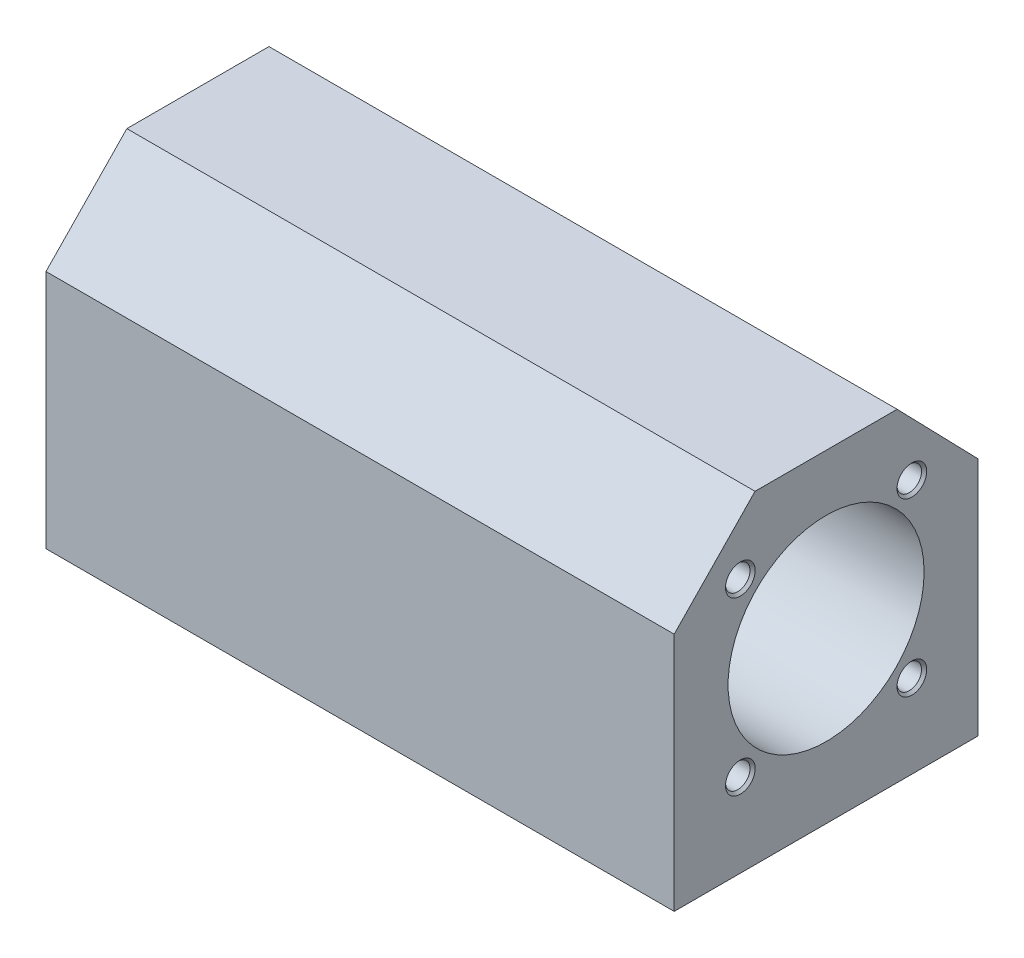
ISO-10303-21;
HEADER;
FILE_DESCRIPTION(('STEP AP214'),'2;1');
FILE_NAME('part.step','',(''),(''),'','','');
FILE_SCHEMA(('AUTOMOTIVE_DESIGN { 1 0 10303 214 1 1 1 1 }'));
ENDSEC;
DATA;
#1=APPLICATION_CONTEXT('core data for automotive mechanical design processes');
#2=APPLICATION_PROTOCOL_DEFINITION('international standard','automotive_design',2000,#1);
#3=PRODUCT_CONTEXT('',#1,'mechanical');
#4=PRODUCT('Part','Part','',(#3));
#5=PRODUCT_RELATED_PRODUCT_CATEGORY('part','',(#4));
#6=PRODUCT_DEFINITION_FORMATION('','',#4);
#7=PRODUCT_DEFINITION_CONTEXT('part definition',#1,'design');
#8=PRODUCT_DEFINITION('design','',#6,#7);
#9=PRODUCT_DEFINITION_SHAPE('','',#8);
#10=(LENGTH_UNIT() NAMED_UNIT(*) SI_UNIT(.MILLI.,.METRE.));
#11=(NAMED_UNIT(*) PLANE_ANGLE_UNIT() SI_UNIT($,.RADIAN.));
#12=(NAMED_UNIT(*) SI_UNIT($,.STERADIAN.) SOLID_ANGLE_UNIT());
#13=UNCERTAINTY_MEASURE_WITH_UNIT(LENGTH_MEASURE(1.E-05),#10,'distance_accuracy_value','');
#14=(GEOMETRIC_REPRESENTATION_CONTEXT(3) GLOBAL_UNCERTAINTY_ASSIGNED_CONTEXT((#13)) GLOBAL_UNIT_ASSIGNED_CONTEXT((#10,
#11,#12)) REPRESENTATION_CONTEXT('',''));
#15=CARTESIAN_POINT('',(0.,0.,0.));
#16=DIRECTION('',(0.,0.,1.));
#17=DIRECTION('',(1.,0.,0.));
#18=AXIS2_PLACEMENT_3D('',#15,#16,#17);
#19=CARTESIAN_POINT('',(-128.2,34.5,-31.));
#20=DIRECTION('',(1.,0.,0.));
#21=DIRECTION('',(0.,0.,-1.));
#22=AXIS2_PLACEMENT_3D('',#19,#20,#21);
#23=CYLINDRICAL_SURFACE('',#22,12.5);
#24=CARTESIAN_POINT('',(-78.2,34.5,-31.));
#25=DIRECTION('',(-1.,0.,0.));
#26=DIRECTION('',(0.,0.,1.));
#27=AXIS2_PLACEMENT_3D('',#24,#25,#26);
#28=CIRCLE('',#27,12.5);
#29=CARTESIAN_POINT('',(-78.2,34.5,-18.5));
#30=VERTEX_POINT('',#29);
#31=EDGE_CURVE('E149',#30,#30,#28,.F.);
#32=ORIENTED_EDGE('',*,*,#31,.F.);
#33=EDGE_LOOP('',(#32));
#34=FACE_BOUND('',#33,.T.);
#35=CARTESIAN_POINT('',(-70.,34.5,-31.));
#36=DIRECTION('',(1.,0.,0.));
#37=DIRECTION('',(0.,0.,-1.));
#38=AXIS2_PLACEMENT_3D('',#35,#36,#37);
#39=CIRCLE('',#38,12.5);
#40=CARTESIAN_POINT('',(-70.,34.5,-43.5));
#41=VERTEX_POINT('',#40);
#42=EDGE_CURVE('E42',#41,#41,#39,.F.);
#43=ORIENTED_EDGE('',*,*,#42,.F.);
#44=EDGE_LOOP('',(#43));
#45=FACE_BOUND('',#44,.T.);
#46=ADVANCED_FACE('F38',(#34,#45),#23,.F.);
#47=CARTESIAN_POINT('',(-128.2,0.,0.));
#48=DIRECTION('',(0.,0.,1.));
#49=DIRECTION('',(1.,0.,0.));
#50=AXIS2_PLACEMENT_3D('',#47,#48,#49);
#51=PLANE('',#50);
#52=DIRECTION('',(0.,-1.,0.));
#53=VECTOR('',#52,1.);
#54=CARTESIAN_POINT('',(0.,0.,0.));
#55=LINE('',#54,#53);
#56=CARTESIAN_POINT('',(0.,49.,0.));
#57=VERTEX_POINT('',#56);
#58=CARTESIAN_POINT('',(0.,0.,0.));
#59=VERTEX_POINT('',#58);
#60=EDGE_CURVE('E128',#57,#59,#55,.T.);
#61=ORIENTED_EDGE('',*,*,#60,.F.);
#62=DIRECTION('',(1.,0.,0.));
#63=VECTOR('',#62,1.);
#64=CARTESIAN_POINT('',(-128.2,49.,0.));
#65=LINE('',#64,#63);
#66=CARTESIAN_POINT('',(-128.2,49.,0.));
#67=VERTEX_POINT('',#66);
#68=EDGE_CURVE('E11',#67,#57,#65,.T.);
#69=ORIENTED_EDGE('',*,*,#68,.F.);
#70=DIRECTION('',(0.,-1.,0.));
#71=VECTOR('',#70,1.);
#72=CARTESIAN_POINT('',(-128.2,0.,0.));
#73=LINE('',#72,#71);
#74=CARTESIAN_POINT('',(-128.2,0.,0.));
#75=VERTEX_POINT('',#74);
#76=EDGE_CURVE('E143',#67,#75,#73,.T.);
#77=ORIENTED_EDGE('',*,*,#76,.T.);
#78=DIRECTION('',(1.,0.,0.));
#79=VECTOR('',#78,1.);
#80=CARTESIAN_POINT('',(-128.2,0.,0.));
#81=LINE('',#80,#79);
#82=EDGE_CURVE('E90',#75,#59,#81,.T.);
#83=ORIENTED_EDGE('',*,*,#82,.T.);
#84=EDGE_LOOP('',(#61,#69,#77,#83));
#85=FACE_BOUND('',#84,.T.);
#86=ADVANCED_FACE('F40',(#85),#51,.T.);
#87=CARTESIAN_POINT('',(-128.2,49.,0.));
#88=DIRECTION('',(0.,0.69647537716866,0.717580691628316));
#89=DIRECTION('',(0.,-0.717580691628316,0.69647537716866));
#90=AXIS2_PLACEMENT_3D('',#87,#88,#89);
#91=PLANE('',#90);
#92=DIRECTION('',(0.,-0.717580691628316,0.69647537716866));
#93=VECTOR('',#92,1.);
#94=CARTESIAN_POINT('',(0.,49.,0.));
#95=LINE('',#94,#93);
#96=CARTESIAN_POINT('',(0.,66.,-16.5));
#97=VERTEX_POINT('',#96);
#98=EDGE_CURVE('E141',#97,#57,#95,.T.);
#99=ORIENTED_EDGE('',*,*,#98,.F.);
#100=DIRECTION('',(1.,0.,0.));
#101=VECTOR('',#100,1.);
#102=CARTESIAN_POINT('',(-128.2,66.,-16.5));
#103=LINE('',#102,#101);
#104=CARTESIAN_POINT('',(-128.2,66.,-16.5));
#105=VERTEX_POINT('',#104);
#106=EDGE_CURVE('E48',#105,#97,#103,.T.);
#107=ORIENTED_EDGE('',*,*,#106,.F.);
#108=DIRECTION('',(0.,-0.717580691628316,0.69647537716866));
#109=VECTOR('',#108,1.);
#110=CARTESIAN_POINT('',(-128.2,49.,0.));
#111=LINE('',#110,#109);
#112=EDGE_CURVE('E118',#105,#67,#111,.T.);
#113=ORIENTED_EDGE('',*,*,#112,.T.);
#114=ORIENTED_EDGE('',*,*,#68,.T.);
#115=EDGE_LOOP('',(#99,#107,#113,#114));
#116=FACE_BOUND('',#115,.T.);
#117=ADVANCED_FACE('F204',(#116),#91,.T.);
#118=CARTESIAN_POINT('',(-128.2,66.,-16.5));
#119=DIRECTION('',(0.,1.,0.));
#120=DIRECTION('',(0.,0.,1.));
#121=AXIS2_PLACEMENT_3D('',#118,#119,#120);
#122=PLANE('',#121);
#123=DIRECTION('',(0.,0.,1.));
#124=VECTOR('',#123,1.);
#125=CARTESIAN_POINT('',(0.,66.,-16.5));
#126=LINE('',#125,#124);
#127=CARTESIAN_POINT('',(0.,66.,-45.5));
#128=VERTEX_POINT('',#127);
#129=EDGE_CURVE('E105',#128,#97,#126,.T.);
#130=ORIENTED_EDGE('',*,*,#129,.F.);
#131=DIRECTION('',(1.,0.,0.));
#132=VECTOR('',#131,1.);
#133=CARTESIAN_POINT('',(-128.2,66.,-45.5));
#134=LINE('',#133,#132);
#135=CARTESIAN_POINT('',(-128.2,66.,-45.5));
#136=VERTEX_POINT('',#135);
#137=EDGE_CURVE('E100',#136,#128,#134,.T.);
#138=ORIENTED_EDGE('',*,*,#137,.F.);
#139=DIRECTION('',(0.,0.,1.));
#140=VECTOR('',#139,1.);
#141=CARTESIAN_POINT('',(-128.2,66.,-16.5));
#142=LINE('',#141,#140);
#143=EDGE_CURVE('E103',#136,#105,#142,.T.);
#144=ORIENTED_EDGE('',*,*,#143,.T.);
#145=ORIENTED_EDGE('',*,*,#106,.T.);
#146=EDGE_LOOP('',(#130,#138,#144,#145));
#147=FACE_BOUND('',#146,.T.);
#148=ADVANCED_FACE('F102',(#147),#122,.T.);
#149=CARTESIAN_POINT('',(-128.2,66.,-45.5));
#150=DIRECTION('',(0.,0.69647537716866,-0.717580691628316));
#151=DIRECTION('',(0.,0.717580691628316,0.69647537716866));
#152=AXIS2_PLACEMENT_3D('',#149,#150,#151);
#153=PLANE('',#152);
#154=DIRECTION('',(0.,0.717580691628316,0.69647537716866));
#155=VECTOR('',#154,1.);
#156=CARTESIAN_POINT('',(0.,66.,-45.5));
#157=LINE('',#156,#155);
#158=CARTESIAN_POINT('',(0.,49.,-62.));
#159=VERTEX_POINT('',#158);
#160=EDGE_CURVE('E138',#159,#128,#157,.T.);
#161=ORIENTED_EDGE('',*,*,#160,.F.);
#162=DIRECTION('',(1.,0.,0.));
#163=VECTOR('',#162,1.);
#164=CARTESIAN_POINT('',(-128.2,49.,-62.));
#165=LINE('',#164,#163);
#166=CARTESIAN_POINT('',(-128.2,49.,-62.));
#167=VERTEX_POINT('',#166);
#168=EDGE_CURVE('E110',#167,#159,#165,.T.);
#169=ORIENTED_EDGE('',*,*,#168,.F.);
#170=DIRECTION('',(0.,0.717580691628316,0.69647537716866));
#171=VECTOR('',#170,1.);
#172=CARTESIAN_POINT('',(-128.2,66.,-45.5));
#173=LINE('',#172,#171);
#174=EDGE_CURVE('E116',#167,#136,#173,.T.);
#175=ORIENTED_EDGE('',*,*,#174,.T.);
#176=ORIENTED_EDGE('',*,*,#137,.T.);
#177=EDGE_LOOP('',(#161,#169,#175,#176));
#178=FACE_BOUND('',#177,.T.);
#179=ADVANCED_FACE('F120',(#178),#153,.T.);
#180=CARTESIAN_POINT('',(-128.2,0.,-62.));
#181=DIRECTION('',(0.,0.,-1.));
#182=DIRECTION('',(-1.,0.,0.));
#183=AXIS2_PLACEMENT_3D('',#180,#181,#182);
#184=PLANE('',#183);
#185=DIRECTION('',(0.,1.,0.));
#186=VECTOR('',#185,1.);
#187=CARTESIAN_POINT('',(0.,0.,-62.));
#188=LINE('',#187,#186);
#189=CARTESIAN_POINT('',(0.,0.,-62.));
#190=VERTEX_POINT('',#189);
#191=EDGE_CURVE('E135',#190,#159,#188,.T.);
#192=ORIENTED_EDGE('',*,*,#191,.F.);
#193=DIRECTION('',(1.,0.,0.));
#194=VECTOR('',#193,1.);
#195=CARTESIAN_POINT('',(-128.2,0.,-62.));
#196=LINE('',#195,#194);
#197=CARTESIAN_POINT('',(-128.2,0.,-62.));
#198=VERTEX_POINT('',#197);
#199=EDGE_CURVE('E147',#198,#190,#196,.T.);
#200=ORIENTED_EDGE('',*,*,#199,.F.);
#201=DIRECTION('',(0.,1.,0.));
#202=VECTOR('',#201,1.);
#203=CARTESIAN_POINT('',(-128.2,0.,-62.));
#204=LINE('',#203,#202);
#205=EDGE_CURVE('E121',#198,#167,#204,.T.);
#206=ORIENTED_EDGE('',*,*,#205,.T.);
#207=ORIENTED_EDGE('',*,*,#168,.T.);
#208=EDGE_LOOP('',(#192,#200,#206,#207));
#209=FACE_BOUND('',#208,.T.);
#210=ADVANCED_FACE('F414',(#209),#184,.T.);
#211=CARTESIAN_POINT('',(-128.2,0.,0.));
#212=DIRECTION('',(0.,-1.,0.));
#213=DIRECTION('',(0.,0.,-1.));
#214=AXIS2_PLACEMENT_3D('',#211,#212,#213);
#215=PLANE('',#214);
#216=DIRECTION('',(0.,0.,-1.));
#217=VECTOR('',#216,1.);
#218=CARTESIAN_POINT('',(0.,0.,0.));
#219=LINE('',#218,#217);
#220=EDGE_CURVE('E131',#59,#190,#219,.T.);
#221=ORIENTED_EDGE('',*,*,#220,.F.);
#222=ORIENTED_EDGE('',*,*,#82,.F.);
#223=DIRECTION('',(0.,0.,-1.));
#224=VECTOR('',#223,1.);
#225=CARTESIAN_POINT('',(-128.2,0.,0.));
#226=LINE('',#225,#224);
#227=EDGE_CURVE('E123',#75,#198,#226,.T.);
#228=ORIENTED_EDGE('',*,*,#227,.T.);
#229=ORIENTED_EDGE('',*,*,#199,.T.);
#230=EDGE_LOOP('',(#221,#222,#228,#229));
#231=FACE_BOUND('',#230,.T.);
#232=ADVANCED_FACE('F200',(#231),#215,.T.);
#233=CARTESIAN_POINT('',(-128.2,0.,0.));
#234=DIRECTION('',(-1.,0.,0.));
#235=DIRECTION('',(0.,0.,1.));
#236=AXIS2_PLACEMENT_3D('',#233,#234,#235);
#237=PLANE('',#236);
#238=CARTESIAN_POINT('',(-128.2,34.5,-31.));
#239=DIRECTION('',(-1.,0.,0.));
#240=DIRECTION('',(0.,0.,1.));
#241=AXIS2_PLACEMENT_3D('',#238,#239,#240);
#242=CIRCLE('',#241,29.);
#243=CARTESIAN_POINT('',(-128.2,34.5,-2.));
#244=VERTEX_POINT('',#243);
#245=EDGE_CURVE('E159',#244,#244,#242,.T.);
#246=ORIENTED_EDGE('',*,*,#245,.F.);
#247=EDGE_LOOP('',(#246));
#248=FACE_BOUND('',#247,.T.);
#249=ORIENTED_EDGE('',*,*,#76,.F.);
#250=ORIENTED_EDGE('',*,*,#112,.F.);
#251=ORIENTED_EDGE('',*,*,#143,.F.);
#252=ORIENTED_EDGE('',*,*,#174,.F.);
#253=ORIENTED_EDGE('',*,*,#205,.F.);
#254=ORIENTED_EDGE('',*,*,#227,.F.);
#255=EDGE_LOOP('',(#249,#250,#251,#252,#253,#254));
#256=FACE_BOUND('',#255,.T.);
#257=ADVANCED_FACE('F114',(#248,#256),#237,.T.);
#258=CARTESIAN_POINT('',(0.,0.,0.));
#259=DIRECTION('',(-1.,0.,0.));
#260=DIRECTION('',(0.,0.,1.));
#261=AXIS2_PLACEMENT_3D('',#258,#259,#260);
#262=PLANE('',#261);
#263=CARTESIAN_POINT('',(0.,34.5,-31.));
#264=DIRECTION('',(1.,0.,0.));
#265=DIRECTION('',(0.,0.,-1.));
#266=AXIS2_PLACEMENT_3D('',#263,#264,#265);
#267=CIRCLE('',#266,20.);
#268=CARTESIAN_POINT('',(0.,34.5,-51.));
#269=VERTEX_POINT('',#268);
#270=EDGE_CURVE('E166',#269,#269,#267,.T.);
#271=ORIENTED_EDGE('',*,*,#270,.F.);
#272=EDGE_LOOP('',(#271));
#273=FACE_BOUND('',#272,.T.);
#274=CARTESIAN_POINT('',(0.,52.,-13.5));
#275=DIRECTION('',(1.,0.,0.));
#276=DIRECTION('',(0.,0.,-1.));
#277=AXIS2_PLACEMENT_3D('',#274,#275,#276);
#278=CIRCLE('',#277,3.025);
#279=CARTESIAN_POINT('',(0.,52.,-16.525));
#280=VERTEX_POINT('',#279);
#281=EDGE_CURVE('E151',#280,#280,#278,.T.);
#282=ORIENTED_EDGE('',*,*,#281,.F.);
#283=EDGE_LOOP('',(#282));
#284=FACE_BOUND('',#283,.T.);
#285=CARTESIAN_POINT('',(0.,52.,-48.5));
#286=DIRECTION('',(1.,0.,0.));
#287=DIRECTION('',(0.,0.,-1.));
#288=AXIS2_PLACEMENT_3D('',#285,#286,#287);
#289=CIRCLE('',#288,3.025);
#290=CARTESIAN_POINT('',(0.,52.,-51.525));
#291=VERTEX_POINT('',#290);
#292=EDGE_CURVE('E174',#291,#291,#289,.T.);
#293=ORIENTED_EDGE('',*,*,#292,.F.);
#294=EDGE_LOOP('',(#293));
#295=FACE_BOUND('',#294,.T.);
#296=CARTESIAN_POINT('',(0.,17.,-48.5));
#297=DIRECTION('',(1.,0.,0.));
#298=DIRECTION('',(0.,0.,-1.));
#299=AXIS2_PLACEMENT_3D('',#296,#297,#298);
#300=CIRCLE('',#299,3.025);
#301=CARTESIAN_POINT('',(0.,17.,-51.525));
#302=VERTEX_POINT('',#301);
#303=EDGE_CURVE('E183',#302,#302,#300,.T.);
#304=ORIENTED_EDGE('',*,*,#303,.F.);
#305=EDGE_LOOP('',(#304));
#306=FACE_BOUND('',#305,.T.);
#307=CARTESIAN_POINT('',(0.,17.,-13.5));
#308=DIRECTION('',(1.,0.,0.));
#309=DIRECTION('',(0.,0.,-1.));
#310=AXIS2_PLACEMENT_3D('',#307,#308,#309);
#311=CIRCLE('',#310,3.025);
#312=CARTESIAN_POINT('',(0.,17.,-16.525));
#313=VERTEX_POINT('',#312);
#314=EDGE_CURVE('E192',#313,#313,#311,.T.);
#315=ORIENTED_EDGE('',*,*,#314,.F.);
#316=EDGE_LOOP('',(#315));
#317=FACE_BOUND('',#316,.T.);
#318=ORIENTED_EDGE('',*,*,#60,.T.);
#319=ORIENTED_EDGE('',*,*,#220,.T.);
#320=ORIENTED_EDGE('',*,*,#191,.T.);
#321=ORIENTED_EDGE('',*,*,#160,.T.);
#322=ORIENTED_EDGE('',*,*,#129,.T.);
#323=ORIENTED_EDGE('',*,*,#98,.T.);
#324=EDGE_LOOP('',(#318,#319,#320,#321,#322,#323));
#325=FACE_BOUND('',#324,.T.);
#326=ADVANCED_FACE('F203',(#273,#284,#295,#306,#317,#325),#262,.F.);
#327=CARTESIAN_POINT('',(-20.45,17.,-13.5));
#328=DIRECTION('',(1.,0.,0.));
#329=DIRECTION('',(0.,0.,-1.));
#330=AXIS2_PLACEMENT_3D('',#327,#328,#329);
#331=CONICAL_SURFACE('',#330,2.49999999999999,1.02974425867665);
#332=CARTESIAN_POINT('',(-21.9521515475689,17.,-13.5));
#333=VERTEX_POINT('',#332);
#334=VERTEX_LOOP('',#333);
#335=FACE_BOUND('',#334,.T.);
#336=CARTESIAN_POINT('',(-20.45,17.,-13.5));
#337=DIRECTION('',(1.,0.,0.));
#338=DIRECTION('',(0.,0.,-1.));
#339=AXIS2_PLACEMENT_3D('',#336,#337,#338);
#340=CIRCLE('',#339,2.49999999999999);
#341=CARTESIAN_POINT('',(-20.45,17.,-16.));
#342=VERTEX_POINT('',#341);
#343=EDGE_CURVE('E132',#342,#342,#340,.T.);
#344=ORIENTED_EDGE('',*,*,#343,.T.);
#345=EDGE_LOOP('',(#344));
#346=FACE_BOUND('',#345,.T.);
#347=ADVANCED_FACE('F267',(#335,#346),#331,.F.);
#348=CARTESIAN_POINT('',(0.,17.,-13.5));
#349=DIRECTION('',(1.,0.,0.));
#350=DIRECTION('',(0.,0.,-1.));
#351=AXIS2_PLACEMENT_3D('',#348,#349,#350);
#352=CYLINDRICAL_SURFACE('',#351,2.49999999999999);
#353=ORIENTED_EDGE('',*,*,#343,.F.);
#354=EDGE_LOOP('',(#353));
#355=FACE_BOUND('',#354,.T.);
#356=CARTESIAN_POINT('',(-0.525000000000001,17.,-13.5));
#357=DIRECTION('',(1.,0.,0.));
#358=DIRECTION('',(0.,0.,-1.));
#359=AXIS2_PLACEMENT_3D('',#356,#357,#358);
#360=CIRCLE('',#359,2.5);
#361=CARTESIAN_POINT('',(-0.525000000000001,17.,-16.));
#362=VERTEX_POINT('',#361);
#363=EDGE_CURVE('E195',#362,#362,#360,.T.);
#364=ORIENTED_EDGE('',*,*,#363,.T.);
#365=EDGE_LOOP('',(#364));
#366=FACE_BOUND('',#365,.T.);
#367=ADVANCED_FACE('F263',(#355,#366),#352,.F.);
#368=CARTESIAN_POINT('',(0.,17.,-13.5));
#369=DIRECTION('',(1.,0.,0.));
#370=DIRECTION('',(0.,0.,-1.));
#371=AXIS2_PLACEMENT_3D('',#368,#369,#370);
#372=CONICAL_SURFACE('',#371,3.025,0.785398163397447);
#373=ORIENTED_EDGE('',*,*,#363,.F.);
#374=EDGE_LOOP('',(#373));
#375=FACE_BOUND('',#374,.T.);
#376=ORIENTED_EDGE('',*,*,#314,.T.);
#377=EDGE_LOOP('',(#376));
#378=FACE_BOUND('',#377,.T.);
#379=ADVANCED_FACE('F259',(#375,#378),#372,.F.);
#380=CARTESIAN_POINT('',(-20.45,17.,-48.5));
#381=DIRECTION('',(1.,0.,0.));
#382=DIRECTION('',(0.,0.,-1.));
#383=AXIS2_PLACEMENT_3D('',#380,#381,#382);
#384=CONICAL_SURFACE('',#383,2.49999999999999,1.02974425867665);
#385=CARTESIAN_POINT('',(-21.9521515475689,17.,-48.5));
#386=VERTEX_POINT('',#385);
#387=VERTEX_LOOP('',#386);
#388=FACE_BOUND('',#387,.T.);
#389=CARTESIAN_POINT('',(-20.45,17.,-48.5));
#390=DIRECTION('',(1.,0.,0.));
#391=DIRECTION('',(0.,0.,-1.));
#392=AXIS2_PLACEMENT_3D('',#389,#390,#391);
#393=CIRCLE('',#392,2.49999999999999);
#394=CARTESIAN_POINT('',(-20.45,17.,-51.));
#395=VERTEX_POINT('',#394);
#396=EDGE_CURVE('E189',#395,#395,#393,.T.);
#397=ORIENTED_EDGE('',*,*,#396,.T.);
#398=EDGE_LOOP('',(#397));
#399=FACE_BOUND('',#398,.T.);
#400=ADVANCED_FACE('F255',(#388,#399),#384,.F.);
#401=CARTESIAN_POINT('',(0.,17.,-48.5));
#402=DIRECTION('',(1.,0.,0.));
#403=DIRECTION('',(0.,0.,-1.));
#404=AXIS2_PLACEMENT_3D('',#401,#402,#403);
#405=CYLINDRICAL_SURFACE('',#404,2.49999999999999);
#406=ORIENTED_EDGE('',*,*,#396,.F.);
#407=EDGE_LOOP('',(#406));
#408=FACE_BOUND('',#407,.T.);
#409=CARTESIAN_POINT('',(-0.525000000000001,17.,-48.5));
#410=DIRECTION('',(1.,0.,0.));
#411=DIRECTION('',(0.,0.,-1.));
#412=AXIS2_PLACEMENT_3D('',#409,#410,#411);
#413=CIRCLE('',#412,2.5);
#414=CARTESIAN_POINT('',(-0.525000000000001,17.,-51.));
#415=VERTEX_POINT('',#414);
#416=EDGE_CURVE('E186',#415,#415,#413,.T.);
#417=ORIENTED_EDGE('',*,*,#416,.T.);
#418=EDGE_LOOP('',(#417));
#419=FACE_BOUND('',#418,.T.);
#420=ADVANCED_FACE('F251',(#408,#419),#405,.F.);
#421=CARTESIAN_POINT('',(0.,17.,-48.5));
#422=DIRECTION('',(1.,0.,0.));
#423=DIRECTION('',(0.,0.,-1.));
#424=AXIS2_PLACEMENT_3D('',#421,#422,#423);
#425=CONICAL_SURFACE('',#424,3.025,0.785398163397447);
#426=ORIENTED_EDGE('',*,*,#416,.F.);
#427=EDGE_LOOP('',(#426));
#428=FACE_BOUND('',#427,.T.);
#429=ORIENTED_EDGE('',*,*,#303,.T.);
#430=EDGE_LOOP('',(#429));
#431=FACE_BOUND('',#430,.T.);
#432=ADVANCED_FACE('F247',(#428,#431),#425,.F.);
#433=CARTESIAN_POINT('',(-20.45,52.,-48.5));
#434=DIRECTION('',(1.,0.,0.));
#435=DIRECTION('',(0.,0.,-1.));
#436=AXIS2_PLACEMENT_3D('',#433,#434,#435);
#437=CONICAL_SURFACE('',#436,2.49999999999999,1.02974425867665);
#438=CARTESIAN_POINT('',(-21.9521515475689,52.,-48.5));
#439=VERTEX_POINT('',#438);
#440=VERTEX_LOOP('',#439);
#441=FACE_BOUND('',#440,.T.);
#442=CARTESIAN_POINT('',(-20.45,52.,-48.5));
#443=DIRECTION('',(1.,0.,0.));
#444=DIRECTION('',(0.,0.,-1.));
#445=AXIS2_PLACEMENT_3D('',#442,#443,#444);
#446=CIRCLE('',#445,2.49999999999999);
#447=CARTESIAN_POINT('',(-20.45,52.,-51.));
#448=VERTEX_POINT('',#447);
#449=EDGE_CURVE('E180',#448,#448,#446,.T.);
#450=ORIENTED_EDGE('',*,*,#449,.T.);
#451=EDGE_LOOP('',(#450));
#452=FACE_BOUND('',#451,.T.);
#453=ADVANCED_FACE('F243',(#441,#452),#437,.F.);
#454=CARTESIAN_POINT('',(0.,52.,-48.5));
#455=DIRECTION('',(1.,0.,0.));
#456=DIRECTION('',(0.,0.,-1.));
#457=AXIS2_PLACEMENT_3D('',#454,#455,#456);
#458=CYLINDRICAL_SURFACE('',#457,2.49999999999999);
#459=ORIENTED_EDGE('',*,*,#449,.F.);
#460=EDGE_LOOP('',(#459));
#461=FACE_BOUND('',#460,.T.);
#462=CARTESIAN_POINT('',(-0.525000000000001,52.,-48.5));
#463=DIRECTION('',(1.,0.,0.));
#464=DIRECTION('',(0.,0.,-1.));
#465=AXIS2_PLACEMENT_3D('',#462,#463,#464);
#466=CIRCLE('',#465,2.5);
#467=CARTESIAN_POINT('',(-0.525000000000001,52.,-51.));
#468=VERTEX_POINT('',#467);
#469=EDGE_CURVE('E177',#468,#468,#466,.T.);
#470=ORIENTED_EDGE('',*,*,#469,.T.);
#471=EDGE_LOOP('',(#470));
#472=FACE_BOUND('',#471,.T.);
#473=ADVANCED_FACE('F239',(#461,#472),#458,.F.);
#474=CARTESIAN_POINT('',(0.,52.,-48.5));
#475=DIRECTION('',(1.,0.,0.));
#476=DIRECTION('',(0.,0.,-1.));
#477=AXIS2_PLACEMENT_3D('',#474,#475,#476);
#478=CONICAL_SURFACE('',#477,3.025,0.78539816339745);
#479=ORIENTED_EDGE('',*,*,#469,.F.);
#480=EDGE_LOOP('',(#479));
#481=FACE_BOUND('',#480,.T.);
#482=ORIENTED_EDGE('',*,*,#292,.T.);
#483=EDGE_LOOP('',(#482));
#484=FACE_BOUND('',#483,.T.);
#485=ADVANCED_FACE('F235',(#481,#484),#478,.F.);
#486=CARTESIAN_POINT('',(-20.45,52.,-13.5));
#487=DIRECTION('',(1.,0.,0.));
#488=DIRECTION('',(0.,0.,-1.));
#489=AXIS2_PLACEMENT_3D('',#486,#487,#488);
#490=CONICAL_SURFACE('',#489,2.49999999999999,1.02974425867665);
#491=CARTESIAN_POINT('',(-21.9521515475689,52.,-13.5));
#492=VERTEX_POINT('',#491);
#493=VERTEX_LOOP('',#492);
#494=FACE_BOUND('',#493,.T.);
#495=CARTESIAN_POINT('',(-20.45,52.,-13.5));
#496=DIRECTION('',(1.,0.,0.));
#497=DIRECTION('',(0.,0.,-1.));
#498=AXIS2_PLACEMENT_3D('',#495,#496,#497);
#499=CIRCLE('',#498,2.49999999999999);
#500=CARTESIAN_POINT('',(-20.45,52.,-16.));
#501=VERTEX_POINT('',#500);
#502=EDGE_CURVE('E171',#501,#501,#499,.T.);
#503=ORIENTED_EDGE('',*,*,#502,.T.);
#504=EDGE_LOOP('',(#503));
#505=FACE_BOUND('',#504,.T.);
#506=ADVANCED_FACE('F231',(#494,#505),#490,.F.);
#507=CARTESIAN_POINT('',(0.,52.,-13.5));
#508=DIRECTION('',(1.,0.,0.));
#509=DIRECTION('',(0.,0.,-1.));
#510=AXIS2_PLACEMENT_3D('',#507,#508,#509);
#511=CYLINDRICAL_SURFACE('',#510,2.49999999999999);
#512=ORIENTED_EDGE('',*,*,#502,.F.);
#513=EDGE_LOOP('',(#512));
#514=FACE_BOUND('',#513,.T.);
#515=CARTESIAN_POINT('',(-0.525000000000001,52.,-13.5));
#516=DIRECTION('',(1.,0.,0.));
#517=DIRECTION('',(0.,0.,-1.));
#518=AXIS2_PLACEMENT_3D('',#515,#516,#517);
#519=CIRCLE('',#518,2.5);
#520=CARTESIAN_POINT('',(-0.525000000000001,52.,-16.));
#521=VERTEX_POINT('',#520);
#522=EDGE_CURVE('E156',#521,#521,#519,.T.);
#523=ORIENTED_EDGE('',*,*,#522,.T.);
#524=EDGE_LOOP('',(#523));
#525=FACE_BOUND('',#524,.T.);
#526=ADVANCED_FACE('F227',(#514,#525),#511,.F.);
#527=CARTESIAN_POINT('',(0.,52.,-13.5));
#528=DIRECTION('',(1.,0.,0.));
#529=DIRECTION('',(0.,0.,-1.));
#530=AXIS2_PLACEMENT_3D('',#527,#528,#529);
#531=CONICAL_SURFACE('',#530,3.025,0.78539816339745);
#532=ORIENTED_EDGE('',*,*,#522,.F.);
#533=EDGE_LOOP('',(#532));
#534=FACE_BOUND('',#533,.T.);
#535=ORIENTED_EDGE('',*,*,#281,.T.);
#536=EDGE_LOOP('',(#535));
#537=FACE_BOUND('',#536,.T.);
#538=ADVANCED_FACE('F223',(#534,#537),#531,.F.);
#539=CARTESIAN_POINT('',(-78.2,34.5,-31.));
#540=DIRECTION('',(-1.,0.,0.));
#541=DIRECTION('',(0.,0.,1.));
#542=AXIS2_PLACEMENT_3D('',#539,#540,#541);
#543=PLANE('',#542);
#544=CARTESIAN_POINT('',(-78.2,34.5,-31.));
#545=DIRECTION('',(-1.,0.,0.));
#546=DIRECTION('',(0.,0.,1.));
#547=AXIS2_PLACEMENT_3D('',#544,#545,#546);
#548=CIRCLE('',#547,29.);
#549=CARTESIAN_POINT('',(-78.2,34.5,-2.));
#550=VERTEX_POINT('',#549);
#551=EDGE_CURVE('E152',#550,#550,#548,.T.);
#552=ORIENTED_EDGE('',*,*,#551,.T.);
#553=EDGE_LOOP('',(#552));
#554=FACE_BOUND('',#553,.T.);
#555=ORIENTED_EDGE('',*,*,#31,.T.);
#556=EDGE_LOOP('',(#555));
#557=FACE_BOUND('',#556,.T.);
#558=ADVANCED_FACE('F226',(#554,#557),#543,.T.);
#559=CARTESIAN_POINT('',(-78.2,34.5,-31.));
#560=DIRECTION('',(-1.,0.,0.));
#561=DIRECTION('',(0.,0.,1.));
#562=AXIS2_PLACEMENT_3D('',#559,#560,#561);
#563=CYLINDRICAL_SURFACE('',#562,29.);
#564=ORIENTED_EDGE('',*,*,#551,.F.);
#565=EDGE_LOOP('',(#564));
#566=FACE_BOUND('',#565,.T.);
#567=ORIENTED_EDGE('',*,*,#245,.T.);
#568=EDGE_LOOP('',(#567));
#569=FACE_BOUND('',#568,.T.);
#570=ADVANCED_FACE('F221',(#566,#569),#563,.F.);
#571=CARTESIAN_POINT('',(-70.,34.5,-31.));
#572=DIRECTION('',(1.,0.,0.));
#573=DIRECTION('',(0.,0.,-1.));
#574=AXIS2_PLACEMENT_3D('',#571,#572,#573);
#575=PLANE('',#574);
#576=CARTESIAN_POINT('',(-70.,34.5,-31.));
#577=DIRECTION('',(1.,0.,0.));
#578=DIRECTION('',(0.,0.,-1.));
#579=AXIS2_PLACEMENT_3D('',#576,#577,#578);
#580=CIRCLE('',#579,20.);
#581=CARTESIAN_POINT('',(-70.,34.5,-51.));
#582=VERTEX_POINT('',#581);
#583=EDGE_CURVE('E293',#582,#582,#580,.T.);
#584=ORIENTED_EDGE('',*,*,#583,.T.);
#585=EDGE_LOOP('',(#584));
#586=FACE_BOUND('',#585,.T.);
#587=ORIENTED_EDGE('',*,*,#42,.T.);
#588=EDGE_LOOP('',(#587));
#589=FACE_BOUND('',#588,.T.);
#590=ADVANCED_FACE('F300',(#586,#589),#575,.T.);
#591=CARTESIAN_POINT('',(-70.,34.5,-31.));
#592=DIRECTION('',(1.,0.,0.));
#593=DIRECTION('',(0.,0.,-1.));
#594=AXIS2_PLACEMENT_3D('',#591,#592,#593);
#595=CYLINDRICAL_SURFACE('',#594,20.);
#596=ORIENTED_EDGE('',*,*,#583,.F.);
#597=EDGE_LOOP('',(#596));
#598=FACE_BOUND('',#597,.T.);
#599=ORIENTED_EDGE('',*,*,#270,.T.);
#600=EDGE_LOOP('',(#599));
#601=FACE_BOUND('',#600,.T.);
#602=ADVANCED_FACE('F302',(#598,#601),#595,.F.);
#603=CLOSED_SHELL('',(#46,#86,#117,#148,#179,#210,#232,#257,#326,#347,#367,#379,#400,#420,#432,
#453,#473,#485,#506,#526,#538,#558,#570,#590,#602));
#604=MANIFOLD_SOLID_BREP('B2',#603);
#605=ADVANCED_BREP_SHAPE_REPRESENTATION('',(#18,#604),#14);
#606=SHAPE_DEFINITION_REPRESENTATION(#9,#605);
ENDSEC;
END-ISO-10303-21;
